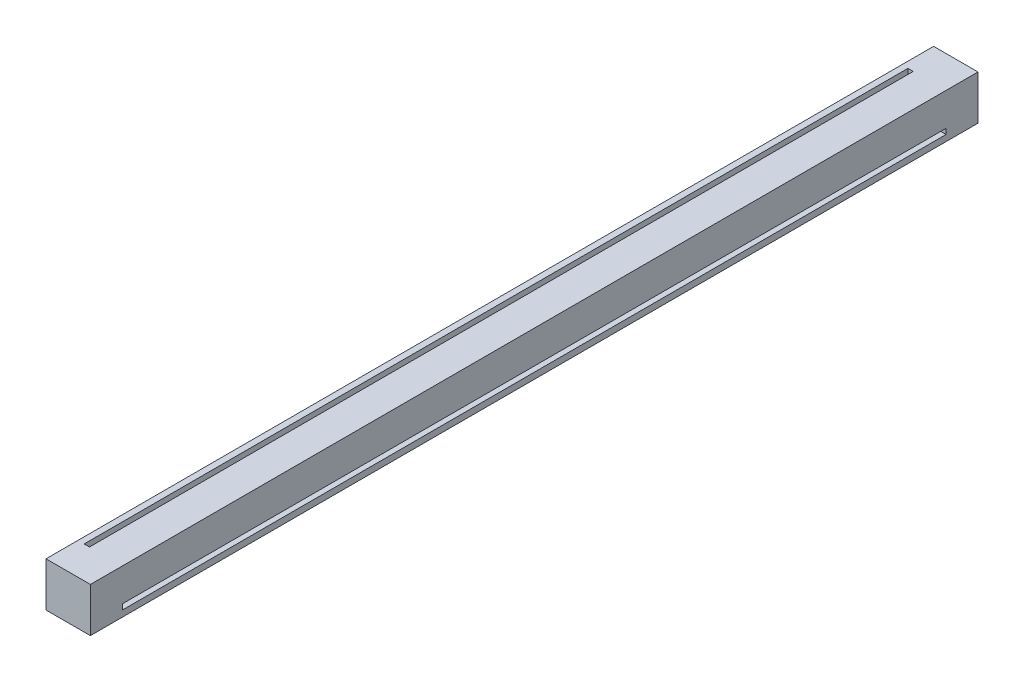
ISO-10303-21;
HEADER;
FILE_DESCRIPTION(('STEP AP214'),'2;1');
FILE_NAME('part.step','',(''),(''),'','','');
FILE_SCHEMA(('AUTOMOTIVE_DESIGN { 1 0 10303 214 1 1 1 1 }'));
ENDSEC;
DATA;
#1=APPLICATION_CONTEXT('core data for automotive mechanical design processes');
#2=APPLICATION_PROTOCOL_DEFINITION('international standard','automotive_design',2000,#1);
#3=PRODUCT_CONTEXT('',#1,'mechanical');
#4=PRODUCT('Part','Part','',(#3));
#5=PRODUCT_RELATED_PRODUCT_CATEGORY('part','',(#4));
#6=PRODUCT_DEFINITION_FORMATION('','',#4);
#7=PRODUCT_DEFINITION_CONTEXT('part definition',#1,'design');
#8=PRODUCT_DEFINITION('design','',#6,#7);
#9=PRODUCT_DEFINITION_SHAPE('','',#8);
#10=(LENGTH_UNIT() NAMED_UNIT(*) SI_UNIT(.MILLI.,.METRE.));
#11=(NAMED_UNIT(*) PLANE_ANGLE_UNIT() SI_UNIT($,.RADIAN.));
#12=(NAMED_UNIT(*) SI_UNIT($,.STERADIAN.) SOLID_ANGLE_UNIT());
#13=UNCERTAINTY_MEASURE_WITH_UNIT(LENGTH_MEASURE(1.E-05),#10,'distance_accuracy_value','');
#14=(GEOMETRIC_REPRESENTATION_CONTEXT(3) GLOBAL_UNCERTAINTY_ASSIGNED_CONTEXT((#13)) GLOBAL_UNIT_ASSIGNED_CONTEXT((#10,
#11,#12)) REPRESENTATION_CONTEXT('',''));
#15=CARTESIAN_POINT('',(0.,0.,0.));
#16=DIRECTION('',(0.,0.,1.));
#17=DIRECTION('',(1.,0.,0.));
#18=AXIS2_PLACEMENT_3D('',#15,#16,#17);
#19=CARTESIAN_POINT('',(0.,0.,500.));
#20=DIRECTION('',(1.,0.,0.));
#21=DIRECTION('',(0.,0.,-1.));
#22=AXIS2_PLACEMENT_3D('',#19,#20,#21);
#23=PLANE('',#22);
#24=DIRECTION('',(0.,-1.,0.));
#25=VECTOR('',#24,1.);
#26=CARTESIAN_POINT('',(0.,0.,0.));
#27=LINE('',#26,#25);
#28=CARTESIAN_POINT('',(0.,25.,0.));
#29=VERTEX_POINT('',#28);
#30=CARTESIAN_POINT('',(0.,0.,0.));
#31=VERTEX_POINT('',#30);
#32=EDGE_CURVE('E192',#29,#31,#27,.T.);
#33=ORIENTED_EDGE('',*,*,#32,.T.);
#34=DIRECTION('',(0.,0.,-1.));
#35=VECTOR('',#34,1.);
#36=CARTESIAN_POINT('',(0.,0.,500.));
#37=LINE('',#36,#35);
#38=CARTESIAN_POINT('',(0.,0.,500.));
#39=VERTEX_POINT('',#38);
#40=EDGE_CURVE('E11',#39,#31,#37,.T.);
#41=ORIENTED_EDGE('',*,*,#40,.F.);
#42=DIRECTION('',(0.,-1.,0.));
#43=VECTOR('',#42,1.);
#44=CARTESIAN_POINT('',(0.,0.,500.));
#45=LINE('',#44,#43);
#46=CARTESIAN_POINT('',(0.,25.,500.));
#47=VERTEX_POINT('',#46);
#48=EDGE_CURVE('E198',#47,#39,#45,.T.);
#49=ORIENTED_EDGE('',*,*,#48,.F.);
#50=DIRECTION('',(0.,0.,-1.));
#51=VECTOR('',#50,1.);
#52=CARTESIAN_POINT('',(0.,25.,500.));
#53=LINE('',#52,#51);
#54=EDGE_CURVE('E208',#47,#29,#53,.T.);
#55=ORIENTED_EDGE('',*,*,#54,.T.);
#56=EDGE_LOOP('',(#33,#41,#49,#55));
#57=FACE_BOUND('',#56,.T.);
#58=ADVANCED_FACE('F33',(#57),#23,.F.);
#59=CARTESIAN_POINT('',(0.,0.,500.));
#60=DIRECTION('',(0.,1.,0.));
#61=DIRECTION('',(0.,0.,1.));
#62=AXIS2_PLACEMENT_3D('',#59,#60,#61);
#63=PLANE('',#62);
#64=DIRECTION('',(1.,0.,0.));
#65=VECTOR('',#64,1.);
#66=CARTESIAN_POINT('',(0.,0.,0.));
#67=LINE('',#66,#65);
#68=CARTESIAN_POINT('',(25.,0.,0.));
#69=VERTEX_POINT('',#68);
#70=EDGE_CURVE('E211',#31,#69,#67,.T.);
#71=ORIENTED_EDGE('',*,*,#70,.T.);
#72=DIRECTION('',(0.,0.,-1.));
#73=VECTOR('',#72,1.);
#74=CARTESIAN_POINT('',(25.,0.,500.));
#75=LINE('',#74,#73);
#76=CARTESIAN_POINT('',(25.,0.,500.));
#77=VERTEX_POINT('',#76);
#78=EDGE_CURVE('E40',#77,#69,#75,.T.);
#79=ORIENTED_EDGE('',*,*,#78,.F.);
#80=DIRECTION('',(1.,0.,0.));
#81=VECTOR('',#80,1.);
#82=CARTESIAN_POINT('',(0.,0.,500.));
#83=LINE('',#82,#81);
#84=EDGE_CURVE('E201',#39,#77,#83,.T.);
#85=ORIENTED_EDGE('',*,*,#84,.F.);
#86=ORIENTED_EDGE('',*,*,#40,.T.);
#87=EDGE_LOOP('',(#71,#79,#85,#86));
#88=FACE_BOUND('',#87,.T.);
#89=ADVANCED_FACE('F241',(#88),#63,.F.);
#90=CARTESIAN_POINT('',(25.,0.,500.));
#91=DIRECTION('',(-1.,0.,0.));
#92=DIRECTION('',(0.,-1.,0.));
#93=AXIS2_PLACEMENT_3D('',#90,#91,#92);
#94=PLANE('',#93);
#95=DIRECTION('',(0.,0.,-1.));
#96=VECTOR('',#95,1.);
#97=CARTESIAN_POINT('',(25.,3.5,482.));
#98=LINE('',#97,#96);
#99=CARTESIAN_POINT('',(25.,3.5,482.));
#100=VERTEX_POINT('',#99);
#101=CARTESIAN_POINT('',(25.,3.5,18.));
#102=VERTEX_POINT('',#101);
#103=EDGE_CURVE('E134',#100,#102,#98,.T.);
#104=ORIENTED_EDGE('',*,*,#103,.F.);
#105=DIRECTION('',(0.,-1.,0.));
#106=VECTOR('',#105,1.);
#107=CARTESIAN_POINT('',(25.,3.5,482.));
#108=LINE('',#107,#106);
#109=CARTESIAN_POINT('',(25.,6.5,482.));
#110=VERTEX_POINT('',#109);
#111=EDGE_CURVE('E47',#110,#100,#108,.T.);
#112=ORIENTED_EDGE('',*,*,#111,.F.);
#113=DIRECTION('',(0.,0.,1.));
#114=VECTOR('',#113,1.);
#115=CARTESIAN_POINT('',(25.,6.5,482.));
#116=LINE('',#115,#114);
#117=CARTESIAN_POINT('',(25.,6.5,18.));
#118=VERTEX_POINT('',#117);
#119=EDGE_CURVE('E143',#118,#110,#116,.T.);
#120=ORIENTED_EDGE('',*,*,#119,.F.);
#121=DIRECTION('',(0.,1.,0.));
#122=VECTOR('',#121,1.);
#123=CARTESIAN_POINT('',(25.,3.5,18.));
#124=LINE('',#123,#122);
#125=EDGE_CURVE('E155',#102,#118,#124,.T.);
#126=ORIENTED_EDGE('',*,*,#125,.F.);
#127=EDGE_LOOP('',(#104,#112,#120,#126));
#128=FACE_BOUND('',#127,.T.);
#129=DIRECTION('',(0.,1.,0.));
#130=VECTOR('',#129,1.);
#131=CARTESIAN_POINT('',(25.,0.,0.));
#132=LINE('',#131,#130);
#133=CARTESIAN_POINT('',(25.,25.,0.));
#134=VERTEX_POINT('',#133);
#135=EDGE_CURVE('E213',#69,#134,#132,.T.);
#136=ORIENTED_EDGE('',*,*,#135,.T.);
#137=DIRECTION('',(0.,0.,-1.));
#138=VECTOR('',#137,1.);
#139=CARTESIAN_POINT('',(25.,25.,500.));
#140=LINE('',#139,#138);
#141=CARTESIAN_POINT('',(25.,25.,500.));
#142=VERTEX_POINT('',#141);
#143=EDGE_CURVE('E218',#142,#134,#140,.T.);
#144=ORIENTED_EDGE('',*,*,#143,.F.);
#145=DIRECTION('',(0.,1.,0.));
#146=VECTOR('',#145,1.);
#147=CARTESIAN_POINT('',(25.,0.,500.));
#148=LINE('',#147,#146);
#149=EDGE_CURVE('E204',#77,#142,#148,.T.);
#150=ORIENTED_EDGE('',*,*,#149,.F.);
#151=ORIENTED_EDGE('',*,*,#78,.T.);
#152=EDGE_LOOP('',(#136,#144,#150,#151));
#153=FACE_BOUND('',#152,.T.);
#154=ADVANCED_FACE('F225',(#128,#153),#94,.F.);
#155=CARTESIAN_POINT('',(0.,25.,500.));
#156=DIRECTION('',(0.,-1.,0.));
#157=DIRECTION('',(0.,0.,-1.));
#158=AXIS2_PLACEMENT_3D('',#155,#156,#157);
#159=PLANE('',#158);
#160=DIRECTION('',(-1.,0.,0.));
#161=VECTOR('',#160,1.);
#162=CARTESIAN_POINT('',(6.5,25.,18.));
#163=LINE('',#162,#161);
#164=CARTESIAN_POINT('',(6.5,25.,18.));
#165=VERTEX_POINT('',#164);
#166=CARTESIAN_POINT('',(3.5,25.,18.));
#167=VERTEX_POINT('',#166);
#168=EDGE_CURVE('E182',#165,#167,#163,.T.);
#169=ORIENTED_EDGE('',*,*,#168,.F.);
#170=DIRECTION('',(0.,0.,-1.));
#171=VECTOR('',#170,1.);
#172=CARTESIAN_POINT('',(6.5,25.,482.));
#173=LINE('',#172,#171);
#174=CARTESIAN_POINT('',(6.5,25.,482.));
#175=VERTEX_POINT('',#174);
#176=EDGE_CURVE('E55',#175,#165,#173,.T.);
#177=ORIENTED_EDGE('',*,*,#176,.F.);
#178=DIRECTION('',(1.,0.,0.));
#179=VECTOR('',#178,1.);
#180=CARTESIAN_POINT('',(6.5,25.,482.));
#181=LINE('',#180,#179);
#182=CARTESIAN_POINT('',(3.5,25.,482.));
#183=VERTEX_POINT('',#182);
#184=EDGE_CURVE('E171',#183,#175,#181,.T.);
#185=ORIENTED_EDGE('',*,*,#184,.F.);
#186=DIRECTION('',(0.,0.,1.));
#187=VECTOR('',#186,1.);
#188=CARTESIAN_POINT('',(3.5,25.,482.));
#189=LINE('',#188,#187);
#190=EDGE_CURVE('E185',#167,#183,#189,.T.);
#191=ORIENTED_EDGE('',*,*,#190,.F.);
#192=EDGE_LOOP('',(#169,#177,#185,#191));
#193=FACE_BOUND('',#192,.T.);
#194=DIRECTION('',(-1.,0.,0.));
#195=VECTOR('',#194,1.);
#196=CARTESIAN_POINT('',(0.,25.,0.));
#197=LINE('',#196,#195);
#198=EDGE_CURVE('E202',#134,#29,#197,.T.);
#199=ORIENTED_EDGE('',*,*,#198,.T.);
#200=ORIENTED_EDGE('',*,*,#54,.F.);
#201=DIRECTION('',(-1.,0.,0.));
#202=VECTOR('',#201,1.);
#203=CARTESIAN_POINT('',(0.,25.,500.));
#204=LINE('',#203,#202);
#205=EDGE_CURVE('E206',#142,#47,#204,.T.);
#206=ORIENTED_EDGE('',*,*,#205,.F.);
#207=ORIENTED_EDGE('',*,*,#143,.T.);
#208=EDGE_LOOP('',(#199,#200,#206,#207));
#209=FACE_BOUND('',#208,.T.);
#210=ADVANCED_FACE('F234',(#193,#209),#159,.F.);
#211=CARTESIAN_POINT('',(0.,0.,500.));
#212=DIRECTION('',(0.,0.,-1.));
#213=DIRECTION('',(-1.,0.,0.));
#214=AXIS2_PLACEMENT_3D('',#211,#212,#213);
#215=PLANE('',#214);
#216=ORIENTED_EDGE('',*,*,#48,.T.);
#217=ORIENTED_EDGE('',*,*,#84,.T.);
#218=ORIENTED_EDGE('',*,*,#149,.T.);
#219=ORIENTED_EDGE('',*,*,#205,.T.);
#220=EDGE_LOOP('',(#216,#217,#218,#219));
#221=FACE_BOUND('',#220,.T.);
#222=ADVANCED_FACE('F240',(#221),#215,.F.);
#223=CARTESIAN_POINT('',(0.,0.,0.));
#224=DIRECTION('',(0.,0.,-1.));
#225=DIRECTION('',(-1.,0.,0.));
#226=AXIS2_PLACEMENT_3D('',#223,#224,#225);
#227=PLANE('',#226);
#228=CARTESIAN_POINT('',(14.,10.,0.));
#229=DIRECTION('',(0.,0.,-1.));
#230=DIRECTION('',(-1.,0.,0.));
#231=AXIS2_PLACEMENT_3D('',#228,#229,#230);
#232=CIRCLE('',#231,1.49999999999999);
#233=CARTESIAN_POINT('',(12.5,10.,0.));
#234=VERTEX_POINT('',#233);
#235=EDGE_CURVE('E132',#234,#234,#232,.T.);
#236=ORIENTED_EDGE('',*,*,#235,.F.);
#237=EDGE_LOOP('',(#236));
#238=FACE_BOUND('',#237,.T.);
#239=ORIENTED_EDGE('',*,*,#32,.F.);
#240=ORIENTED_EDGE('',*,*,#198,.F.);
#241=ORIENTED_EDGE('',*,*,#135,.F.);
#242=ORIENTED_EDGE('',*,*,#70,.F.);
#243=EDGE_LOOP('',(#239,#240,#241,#242));
#244=FACE_BOUND('',#243,.T.);
#245=ADVANCED_FACE('F231',(#238,#244),#227,.T.);
#246=CARTESIAN_POINT('',(6.5,22.,482.));
#247=DIRECTION('',(1.,0.,0.));
#248=DIRECTION('',(0.,0.,-1.));
#249=AXIS2_PLACEMENT_3D('',#246,#247,#248);
#250=PLANE('',#249);
#251=ORIENTED_EDGE('',*,*,#176,.T.);
#252=DIRECTION('',(0.,1.,0.));
#253=VECTOR('',#252,1.);
#254=CARTESIAN_POINT('',(6.5,22.,18.));
#255=LINE('',#254,#253);
#256=CARTESIAN_POINT('',(6.5,22.,18.));
#257=VERTEX_POINT('',#256);
#258=EDGE_CURVE('E180',#257,#165,#255,.T.);
#259=ORIENTED_EDGE('',*,*,#258,.F.);
#260=DIRECTION('',(0.,0.,-1.));
#261=VECTOR('',#260,1.);
#262=CARTESIAN_POINT('',(6.5,22.,482.));
#263=LINE('',#262,#261);
#264=CARTESIAN_POINT('',(6.5,22.,482.));
#265=VERTEX_POINT('',#264);
#266=EDGE_CURVE('E167',#265,#257,#263,.T.);
#267=ORIENTED_EDGE('',*,*,#266,.F.);
#268=DIRECTION('',(0.,1.,0.));
#269=VECTOR('',#268,1.);
#270=CARTESIAN_POINT('',(6.5,22.,482.));
#271=LINE('',#270,#269);
#272=EDGE_CURVE('E190',#265,#175,#271,.T.);
#273=ORIENTED_EDGE('',*,*,#272,.T.);
#274=EDGE_LOOP('',(#251,#259,#267,#273));
#275=FACE_BOUND('',#274,.T.);
#276=ADVANCED_FACE('F255',(#275),#250,.F.);
#277=CARTESIAN_POINT('',(6.5,22.,482.));
#278=DIRECTION('',(0.,0.,1.));
#279=DIRECTION('',(1.,0.,0.));
#280=AXIS2_PLACEMENT_3D('',#277,#278,#279);
#281=PLANE('',#280);
#282=ORIENTED_EDGE('',*,*,#184,.T.);
#283=ORIENTED_EDGE('',*,*,#272,.F.);
#284=DIRECTION('',(1.,0.,0.));
#285=VECTOR('',#284,1.);
#286=CARTESIAN_POINT('',(6.5,22.,482.));
#287=LINE('',#286,#285);
#288=CARTESIAN_POINT('',(3.5,22.,482.));
#289=VERTEX_POINT('',#288);
#290=EDGE_CURVE('E177',#289,#265,#287,.T.);
#291=ORIENTED_EDGE('',*,*,#290,.F.);
#292=DIRECTION('',(0.,1.,0.));
#293=VECTOR('',#292,1.);
#294=CARTESIAN_POINT('',(3.5,22.,482.));
#295=LINE('',#294,#293);
#296=EDGE_CURVE('E193',#289,#183,#295,.T.);
#297=ORIENTED_EDGE('',*,*,#296,.T.);
#298=EDGE_LOOP('',(#282,#283,#291,#297));
#299=FACE_BOUND('',#298,.T.);
#300=ADVANCED_FACE('F261',(#299),#281,.F.);
#301=CARTESIAN_POINT('',(3.5,22.,482.));
#302=DIRECTION('',(-1.,0.,0.));
#303=DIRECTION('',(0.,0.,1.));
#304=AXIS2_PLACEMENT_3D('',#301,#302,#303);
#305=PLANE('',#304);
#306=ORIENTED_EDGE('',*,*,#190,.T.);
#307=ORIENTED_EDGE('',*,*,#296,.F.);
#308=DIRECTION('',(0.,0.,1.));
#309=VECTOR('',#308,1.);
#310=CARTESIAN_POINT('',(3.5,22.,482.));
#311=LINE('',#310,#309);
#312=CARTESIAN_POINT('',(3.5,22.,18.));
#313=VERTEX_POINT('',#312);
#314=EDGE_CURVE('E174',#313,#289,#311,.T.);
#315=ORIENTED_EDGE('',*,*,#314,.F.);
#316=DIRECTION('',(0.,1.,0.));
#317=VECTOR('',#316,1.);
#318=CARTESIAN_POINT('',(3.5,22.,18.));
#319=LINE('',#318,#317);
#320=EDGE_CURVE('E195',#313,#167,#319,.T.);
#321=ORIENTED_EDGE('',*,*,#320,.T.);
#322=EDGE_LOOP('',(#306,#307,#315,#321));
#323=FACE_BOUND('',#322,.T.);
#324=ADVANCED_FACE('F266',(#323),#305,.F.);
#325=CARTESIAN_POINT('',(6.5,22.,18.));
#326=DIRECTION('',(0.,0.,-1.));
#327=DIRECTION('',(-1.,0.,0.));
#328=AXIS2_PLACEMENT_3D('',#325,#326,#327);
#329=PLANE('',#328);
#330=ORIENTED_EDGE('',*,*,#168,.T.);
#331=ORIENTED_EDGE('',*,*,#320,.F.);
#332=DIRECTION('',(-1.,0.,0.));
#333=VECTOR('',#332,1.);
#334=CARTESIAN_POINT('',(6.5,22.,18.));
#335=LINE('',#334,#333);
#336=EDGE_CURVE('E170',#257,#313,#335,.T.);
#337=ORIENTED_EDGE('',*,*,#336,.F.);
#338=ORIENTED_EDGE('',*,*,#258,.T.);
#339=EDGE_LOOP('',(#330,#331,#337,#338));
#340=FACE_BOUND('',#339,.T.);
#341=ADVANCED_FACE('F262',(#340),#329,.F.);
#342=CARTESIAN_POINT('',(0.,22.,0.));
#343=DIRECTION('',(0.,1.,0.));
#344=DIRECTION('',(0.,0.,1.));
#345=AXIS2_PLACEMENT_3D('',#342,#343,#344);
#346=PLANE('',#345);
#347=ORIENTED_EDGE('',*,*,#266,.T.);
#348=ORIENTED_EDGE('',*,*,#336,.T.);
#349=ORIENTED_EDGE('',*,*,#314,.T.);
#350=ORIENTED_EDGE('',*,*,#290,.T.);
#351=EDGE_LOOP('',(#347,#348,#349,#350));
#352=FACE_BOUND('',#351,.T.);
#353=ADVANCED_FACE('F265',(#352),#346,.T.);
#354=CARTESIAN_POINT('',(22.,3.5,482.));
#355=DIRECTION('',(0.,0.,1.));
#356=DIRECTION('',(1.,0.,0.));
#357=AXIS2_PLACEMENT_3D('',#354,#355,#356);
#358=PLANE('',#357);
#359=ORIENTED_EDGE('',*,*,#111,.T.);
#360=DIRECTION('',(1.,0.,0.));
#361=VECTOR('',#360,1.);
#362=CARTESIAN_POINT('',(22.,3.5,482.));
#363=LINE('',#362,#361);
#364=CARTESIAN_POINT('',(22.,3.5,482.));
#365=VERTEX_POINT('',#364);
#366=EDGE_CURVE('E151',#365,#100,#363,.T.);
#367=ORIENTED_EDGE('',*,*,#366,.F.);
#368=DIRECTION('',(0.,-1.,0.));
#369=VECTOR('',#368,1.);
#370=CARTESIAN_POINT('',(22.,3.5,482.));
#371=LINE('',#370,#369);
#372=CARTESIAN_POINT('',(22.,6.5,482.));
#373=VERTEX_POINT('',#372);
#374=EDGE_CURVE('E139',#373,#365,#371,.T.);
#375=ORIENTED_EDGE('',*,*,#374,.F.);
#376=DIRECTION('',(1.,0.,0.));
#377=VECTOR('',#376,1.);
#378=CARTESIAN_POINT('',(22.,6.5,482.));
#379=LINE('',#378,#377);
#380=EDGE_CURVE('E160',#373,#110,#379,.T.);
#381=ORIENTED_EDGE('',*,*,#380,.T.);
#382=EDGE_LOOP('',(#359,#367,#375,#381));
#383=FACE_BOUND('',#382,.T.);
#384=ADVANCED_FACE('F276',(#383),#358,.F.);
#385=CARTESIAN_POINT('',(22.,6.5,482.));
#386=DIRECTION('',(0.,1.,0.));
#387=DIRECTION('',(-1.,0.,0.));
#388=AXIS2_PLACEMENT_3D('',#385,#386,#387);
#389=PLANE('',#388);
#390=ORIENTED_EDGE('',*,*,#119,.T.);
#391=ORIENTED_EDGE('',*,*,#380,.F.);
#392=DIRECTION('',(0.,0.,1.));
#393=VECTOR('',#392,1.);
#394=CARTESIAN_POINT('',(22.,6.5,482.));
#395=LINE('',#394,#393);
#396=CARTESIAN_POINT('',(22.,6.5,18.));
#397=VERTEX_POINT('',#396);
#398=EDGE_CURVE('E149',#397,#373,#395,.T.);
#399=ORIENTED_EDGE('',*,*,#398,.F.);
#400=DIRECTION('',(1.,0.,0.));
#401=VECTOR('',#400,1.);
#402=CARTESIAN_POINT('',(22.,6.5,18.));
#403=LINE('',#402,#401);
#404=EDGE_CURVE('E162',#397,#118,#403,.T.);
#405=ORIENTED_EDGE('',*,*,#404,.T.);
#406=EDGE_LOOP('',(#390,#391,#399,#405));
#407=FACE_BOUND('',#406,.T.);
#408=ADVANCED_FACE('F280',(#407),#389,.F.);
#409=CARTESIAN_POINT('',(22.,3.5,18.));
#410=DIRECTION('',(0.,0.,-1.));
#411=DIRECTION('',(-1.,0.,0.));
#412=AXIS2_PLACEMENT_3D('',#409,#410,#411);
#413=PLANE('',#412);
#414=ORIENTED_EDGE('',*,*,#125,.T.);
#415=ORIENTED_EDGE('',*,*,#404,.F.);
#416=DIRECTION('',(0.,1.,0.));
#417=VECTOR('',#416,1.);
#418=CARTESIAN_POINT('',(22.,3.5,18.));
#419=LINE('',#418,#417);
#420=CARTESIAN_POINT('',(22.,3.5,18.));
#421=VERTEX_POINT('',#420);
#422=EDGE_CURVE('E146',#421,#397,#419,.T.);
#423=ORIENTED_EDGE('',*,*,#422,.F.);
#424=DIRECTION('',(1.,0.,0.));
#425=VECTOR('',#424,1.);
#426=CARTESIAN_POINT('',(22.,3.5,18.));
#427=LINE('',#426,#425);
#428=EDGE_CURVE('E164',#421,#102,#427,.T.);
#429=ORIENTED_EDGE('',*,*,#428,.T.);
#430=EDGE_LOOP('',(#414,#415,#423,#429));
#431=FACE_BOUND('',#430,.T.);
#432=ADVANCED_FACE('F284',(#431),#413,.F.);
#433=CARTESIAN_POINT('',(22.,3.5,482.));
#434=DIRECTION('',(0.,-1.,0.));
#435=DIRECTION('',(1.,0.,0.));
#436=AXIS2_PLACEMENT_3D('',#433,#434,#435);
#437=PLANE('',#436);
#438=ORIENTED_EDGE('',*,*,#103,.T.);
#439=ORIENTED_EDGE('',*,*,#428,.F.);
#440=DIRECTION('',(0.,0.,-1.));
#441=VECTOR('',#440,1.);
#442=CARTESIAN_POINT('',(22.,3.5,482.));
#443=LINE('',#442,#441);
#444=EDGE_CURVE('E142',#365,#421,#443,.T.);
#445=ORIENTED_EDGE('',*,*,#444,.F.);
#446=ORIENTED_EDGE('',*,*,#366,.T.);
#447=EDGE_LOOP('',(#438,#439,#445,#446));
#448=FACE_BOUND('',#447,.T.);
#449=ADVANCED_FACE('F281',(#448),#437,.F.);
#450=CARTESIAN_POINT('',(22.,0.,0.));
#451=DIRECTION('',(-1.,0.,0.));
#452=DIRECTION('',(0.,-1.,0.));
#453=AXIS2_PLACEMENT_3D('',#450,#451,#452);
#454=PLANE('',#453);
#455=ORIENTED_EDGE('',*,*,#374,.T.);
#456=ORIENTED_EDGE('',*,*,#444,.T.);
#457=ORIENTED_EDGE('',*,*,#422,.T.);
#458=ORIENTED_EDGE('',*,*,#398,.T.);
#459=EDGE_LOOP('',(#455,#456,#457,#458));
#460=FACE_BOUND('',#459,.T.);
#461=ADVANCED_FACE('F126',(#460),#454,.F.);
#462=CARTESIAN_POINT('',(14.,10.,16.));
#463=DIRECTION('',(0.,0.,-1.));
#464=DIRECTION('',(-1.,0.,0.));
#465=AXIS2_PLACEMENT_3D('',#462,#463,#464);
#466=CONICAL_SURFACE('',#465,1.5,1.02974425867665);
#467=CARTESIAN_POINT('',(14.,10.,16.9012909285413));
#468=VERTEX_POINT('',#467);
#469=VERTEX_LOOP('',#468);
#470=FACE_BOUND('',#469,.T.);
#471=CARTESIAN_POINT('',(14.,10.,16.));
#472=DIRECTION('',(0.,0.,-1.));
#473=DIRECTION('',(-1.,0.,0.));
#474=AXIS2_PLACEMENT_3D('',#471,#472,#473);
#475=CIRCLE('',#474,1.5);
#476=CARTESIAN_POINT('',(12.5,10.,16.));
#477=VERTEX_POINT('',#476);
#478=EDGE_CURVE('E130',#477,#477,#475,.T.);
#479=ORIENTED_EDGE('',*,*,#478,.T.);
#480=EDGE_LOOP('',(#479));
#481=FACE_BOUND('',#480,.T.);
#482=ADVANCED_FACE('F122',(#470,#481),#466,.F.);
#483=CARTESIAN_POINT('',(14.,10.,0.));
#484=DIRECTION('',(0.,0.,-1.));
#485=DIRECTION('',(-1.,0.,0.));
#486=AXIS2_PLACEMENT_3D('',#483,#484,#485);
#487=CYLINDRICAL_SURFACE('',#486,1.49999999999999);
#488=ORIENTED_EDGE('',*,*,#478,.F.);
#489=EDGE_LOOP('',(#488));
#490=FACE_BOUND('',#489,.T.);
#491=ORIENTED_EDGE('',*,*,#235,.T.);
#492=EDGE_LOOP('',(#491));
#493=FACE_BOUND('',#492,.T.);
#494=ADVANCED_FACE('F125',(#490,#493),#487,.F.);
#495=CLOSED_SHELL('',(#58,#89,#154,#210,#222,#245,#276,#300,#324,#341,#353,#384,#408,#432,#449,
#461,#482,#494));
#496=MANIFOLD_SOLID_BREP('B2',#495);
#497=ADVANCED_BREP_SHAPE_REPRESENTATION('',(#18,#496),#14);
#498=SHAPE_DEFINITION_REPRESENTATION(#9,#497);
ENDSEC;
END-ISO-10303-21;
